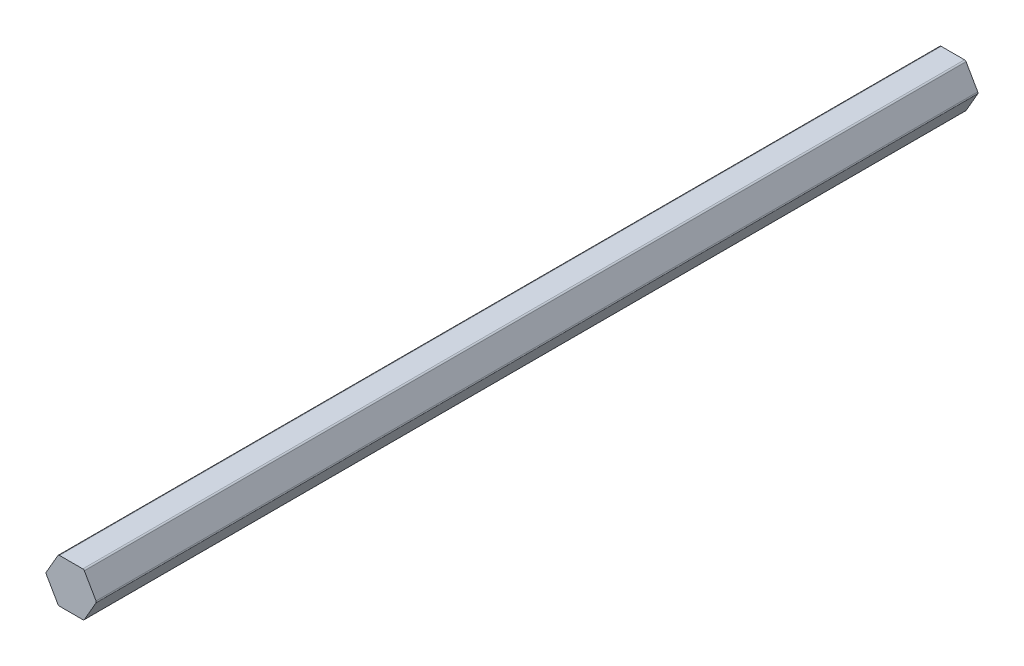
ISO-10303-21;
HEADER;
FILE_DESCRIPTION(('STEP AP214'),'2;1');
FILE_NAME('part.step','',(''),(''),'','','');
FILE_SCHEMA(('AUTOMOTIVE_DESIGN { 1 0 10303 214 1 1 1 1 }'));
ENDSEC;
DATA;
#1=APPLICATION_CONTEXT('core data for automotive mechanical design processes');
#2=APPLICATION_PROTOCOL_DEFINITION('international standard','automotive_design',2000,#1);
#3=PRODUCT_CONTEXT('',#1,'mechanical');
#4=PRODUCT('Part','Part','',(#3));
#5=PRODUCT_RELATED_PRODUCT_CATEGORY('part','',(#4));
#6=PRODUCT_DEFINITION_FORMATION('','',#4);
#7=PRODUCT_DEFINITION_CONTEXT('part definition',#1,'design');
#8=PRODUCT_DEFINITION('design','',#6,#7);
#9=PRODUCT_DEFINITION_SHAPE('','',#8);
#10=(LENGTH_UNIT() NAMED_UNIT(*) SI_UNIT(.MILLI.,.METRE.));
#11=(NAMED_UNIT(*) PLANE_ANGLE_UNIT() SI_UNIT($,.RADIAN.));
#12=(NAMED_UNIT(*) SI_UNIT($,.STERADIAN.) SOLID_ANGLE_UNIT());
#13=UNCERTAINTY_MEASURE_WITH_UNIT(LENGTH_MEASURE(1.E-05),#10,'distance_accuracy_value','');
#14=(GEOMETRIC_REPRESENTATION_CONTEXT(3) GLOBAL_UNCERTAINTY_ASSIGNED_CONTEXT((#13)) GLOBAL_UNIT_ASSIGNED_CONTEXT((#10,
#11,#12)) REPRESENTATION_CONTEXT('',''));
#15=CARTESIAN_POINT('',(0.,0.,0.));
#16=DIRECTION('',(0.,0.,1.));
#17=DIRECTION('',(1.,0.,0.));
#18=AXIS2_PLACEMENT_3D('',#15,#16,#17);
#19=CARTESIAN_POINT('',(-6.73109584837417,0.,457.2));
#20=DIRECTION('',(0.,0.,-1.));
#21=DIRECTION('',(-1.,0.,0.));
#22=AXIS2_PLACEMENT_3D('',#19,#20,#21);
#23=CYLINDRICAL_SURFACE('',#22,0.508);
#24=CARTESIAN_POINT('',(-6.73109584837417,0.,-203.2));
#25=DIRECTION('',(0.,0.,-1.));
#26=DIRECTION('',(-1.,0.,0.));
#27=AXIS2_PLACEMENT_3D('',#24,#25,#26);
#28=CIRCLE('',#27,0.508);
#29=CARTESIAN_POINT('',(-7.23909584837417,0.,-203.2));
#30=VERTEX_POINT('',#29);
#31=CARTESIAN_POINT('',(-7.17103675349666,-0.254000000000007,-203.2));
#32=VERTEX_POINT('',#31);
#33=EDGE_CURVE('E264',#30,#32,#28,.F.);
#34=ORIENTED_EDGE('',*,*,#33,.F.);
#35=DIRECTION('',(0.,0.,-1.));
#36=VECTOR('',#35,1.);
#37=CARTESIAN_POINT('',(-7.23909584837417,0.,457.2));
#38=LINE('',#37,#36);
#39=CARTESIAN_POINT('',(-7.23909584837417,0.,-457.2));
#40=VERTEX_POINT('',#39);
#41=EDGE_CURVE('E52',#30,#40,#38,.T.);
#42=ORIENTED_EDGE('',*,*,#41,.T.);
#43=CARTESIAN_POINT('',(-6.73109584837417,0.,-457.2));
#44=DIRECTION('',(0.,0.,-1.));
#45=DIRECTION('',(1.,0.,0.));
#46=AXIS2_PLACEMENT_3D('',#43,#44,#45);
#47=CIRCLE('',#46,0.508);
#48=CARTESIAN_POINT('',(-7.17103675349666,-0.254000000000004,-457.2));
#49=VERTEX_POINT('',#48);
#50=EDGE_CURVE('E192',#49,#40,#47,.T.);
#51=ORIENTED_EDGE('',*,*,#50,.F.);
#52=DIRECTION('',(0.,0.,-1.));
#53=VECTOR('',#52,1.);
#54=CARTESIAN_POINT('',(-7.17103675349666,-0.254000000000004,457.2));
#55=LINE('',#54,#53);
#56=EDGE_CURVE('E217',#32,#49,#55,.T.);
#57=ORIENTED_EDGE('',*,*,#56,.F.);
#58=EDGE_LOOP('',(#34,#42,#51,#57));
#59=FACE_BOUND('',#58,.T.);
#60=ADVANCED_FACE('F44',(#59),#23,.T.);
#61=CARTESIAN_POINT('',(3.65884186093541,-6.3373,457.2));
#62=DIRECTION('',(-0.866025403784439,0.5,0.));
#63=DIRECTION('',(0.,0.,1.));
#64=AXIS2_PLACEMENT_3D('',#61,#62,#63);
#65=PLANE('',#64);
#66=DIRECTION('',(0.,0.,1.));
#67=VECTOR('',#66,1.);
#68=CARTESIAN_POINT('',(7.17103675349667,-0.253999999999996,457.2));
#69=LINE('',#68,#67);
#70=CARTESIAN_POINT('',(7.17103675349666,-0.254,-457.2));
#71=VERTEX_POINT('',#70);
#72=CARTESIAN_POINT('',(7.17103675349666,-0.254000000000001,-203.2));
#73=VERTEX_POINT('',#72);
#74=EDGE_CURVE('E179',#71,#73,#69,.T.);
#75=ORIENTED_EDGE('',*,*,#74,.T.);
#76=DIRECTION('',(-0.5,-0.866025403784439,0.));
#77=VECTOR('',#76,1.);
#78=CARTESIAN_POINT('',(3.65884186093541,-6.3373,-203.2));
#79=LINE('',#78,#77);
#80=CARTESIAN_POINT('',(3.80548882930958,-6.0833,-203.2));
#81=VERTEX_POINT('',#80);
#82=EDGE_CURVE('E254',#73,#81,#79,.T.);
#83=ORIENTED_EDGE('',*,*,#82,.T.);
#84=DIRECTION('',(0.,0.,-1.));
#85=VECTOR('',#84,1.);
#86=CARTESIAN_POINT('',(3.80548882930958,-6.0833,457.2));
#87=LINE('',#86,#85);
#88=CARTESIAN_POINT('',(3.80548882930958,-6.0833,-457.2));
#89=VERTEX_POINT('',#88);
#90=EDGE_CURVE('E209',#81,#89,#87,.T.);
#91=ORIENTED_EDGE('',*,*,#90,.T.);
#92=DIRECTION('',(0.5,0.866025403784439,0.));
#93=VECTOR('',#92,1.);
#94=CARTESIAN_POINT('',(3.65884186093541,-6.3373,-457.2));
#95=LINE('',#94,#93);
#96=EDGE_CURVE('E205',#89,#71,#95,.T.);
#97=ORIENTED_EDGE('',*,*,#96,.T.);
#98=EDGE_LOOP('',(#75,#83,#91,#97));
#99=FACE_BOUND('',#98,.T.);
#100=ADVANCED_FACE('F293',(#99),#65,.F.);
#101=CARTESIAN_POINT('',(7.31768372187083,0.,457.2));
#102=DIRECTION('',(-0.866025403784439,-0.5,0.));
#103=DIRECTION('',(-0.5,0.866025403784439,0.));
#104=AXIS2_PLACEMENT_3D('',#101,#102,#103);
#105=PLANE('',#104);
#106=DIRECTION('',(0.,0.,1.));
#107=VECTOR('',#106,1.);
#108=CARTESIAN_POINT('',(3.80548882930958,6.0833,457.2));
#109=LINE('',#108,#107);
#110=CARTESIAN_POINT('',(3.80548882930957,6.0833,-457.2));
#111=VERTEX_POINT('',#110);
#112=CARTESIAN_POINT('',(3.80548882930958,6.0833,-203.2));
#113=VERTEX_POINT('',#112);
#114=EDGE_CURVE('E187',#111,#113,#109,.T.);
#115=ORIENTED_EDGE('',*,*,#114,.T.);
#116=DIRECTION('',(0.5,-0.866025403784439,0.));
#117=VECTOR('',#116,1.);
#118=CARTESIAN_POINT('',(7.31768372187083,0.,-203.2));
#119=LINE('',#118,#117);
#120=CARTESIAN_POINT('',(7.17103675349667,0.254000000000004,-203.2));
#121=VERTEX_POINT('',#120);
#122=EDGE_CURVE('E58',#113,#121,#119,.T.);
#123=ORIENTED_EDGE('',*,*,#122,.T.);
#124=DIRECTION('',(0.,0.,-1.));
#125=VECTOR('',#124,1.);
#126=CARTESIAN_POINT('',(7.17103675349666,0.254,457.2));
#127=LINE('',#126,#125);
#128=CARTESIAN_POINT('',(7.17103675349666,0.254000000000004,-457.2));
#129=VERTEX_POINT('',#128);
#130=EDGE_CURVE('E181',#121,#129,#127,.T.);
#131=ORIENTED_EDGE('',*,*,#130,.T.);
#132=DIRECTION('',(-0.5,0.866025403784439,0.));
#133=VECTOR('',#132,1.);
#134=CARTESIAN_POINT('',(7.31768372187083,0.,-457.2));
#135=LINE('',#134,#133);
#136=EDGE_CURVE('E183',#129,#111,#135,.T.);
#137=ORIENTED_EDGE('',*,*,#136,.T.);
#138=EDGE_LOOP('',(#115,#123,#131,#137));
#139=FACE_BOUND('',#138,.T.);
#140=ADVANCED_FACE('F298',(#139),#105,.F.);
#141=CARTESIAN_POINT('',(3.65884186093541,6.3373,457.2));
#142=DIRECTION('',(0.,-1.,0.));
#143=DIRECTION('',(0.,0.,-1.));
#144=AXIS2_PLACEMENT_3D('',#141,#142,#143);
#145=PLANE('',#144);
#146=DIRECTION('',(0.,0.,1.));
#147=VECTOR('',#146,1.);
#148=CARTESIAN_POINT('',(-3.36554792418709,6.3373,457.2));
#149=LINE('',#148,#147);
#150=CARTESIAN_POINT('',(-3.36554792418708,6.3373,-457.2));
#151=VERTEX_POINT('',#150);
#152=CARTESIAN_POINT('',(-3.36554792418708,6.3373,-203.2));
#153=VERTEX_POINT('',#152);
#154=EDGE_CURVE('E162',#151,#153,#149,.T.);
#155=ORIENTED_EDGE('',*,*,#154,.T.);
#156=DIRECTION('',(1.,0.,0.));
#157=VECTOR('',#156,1.);
#158=CARTESIAN_POINT('',(3.65884186093541,6.3373,-203.2));
#159=LINE('',#158,#157);
#160=CARTESIAN_POINT('',(3.36554792418709,6.3373,-203.2));
#161=VERTEX_POINT('',#160);
#162=EDGE_CURVE('E152',#153,#161,#159,.T.);
#163=ORIENTED_EDGE('',*,*,#162,.T.);
#164=DIRECTION('',(0.,0.,-1.));
#165=VECTOR('',#164,1.);
#166=CARTESIAN_POINT('',(3.36554792418709,6.3373,457.2));
#167=LINE('',#166,#165);
#168=CARTESIAN_POINT('',(3.36554792418709,6.3373,-457.2));
#169=VERTEX_POINT('',#168);
#170=EDGE_CURVE('E160',#161,#169,#167,.T.);
#171=ORIENTED_EDGE('',*,*,#170,.T.);
#172=DIRECTION('',(-1.,0.,0.));
#173=VECTOR('',#172,1.);
#174=CARTESIAN_POINT('',(3.65884186093541,6.3373,-457.2));
#175=LINE('',#174,#173);
#176=EDGE_CURVE('E171',#169,#151,#175,.T.);
#177=ORIENTED_EDGE('',*,*,#176,.T.);
#178=EDGE_LOOP('',(#155,#163,#171,#177));
#179=FACE_BOUND('',#178,.T.);
#180=ADVANCED_FACE('F46',(#179),#145,.F.);
#181=CARTESIAN_POINT('',(-3.65884186093541,6.3373,457.2));
#182=DIRECTION('',(0.866025403784439,-0.5,0.));
#183=DIRECTION('',(0.,0.,-1.));
#184=AXIS2_PLACEMENT_3D('',#181,#182,#183);
#185=PLANE('',#184);
#186=DIRECTION('',(0.,0.,1.));
#187=VECTOR('',#186,1.);
#188=CARTESIAN_POINT('',(-7.17103675349666,0.253999999999995,457.2));
#189=LINE('',#188,#187);
#190=CARTESIAN_POINT('',(-7.17103675349666,0.253999999999997,-457.2));
#191=VERTEX_POINT('',#190);
#192=CARTESIAN_POINT('',(-7.17103675349667,0.253999999999996,-203.2));
#193=VERTEX_POINT('',#192);
#194=EDGE_CURVE('E175',#191,#193,#189,.T.);
#195=ORIENTED_EDGE('',*,*,#194,.T.);
#196=DIRECTION('',(0.5,0.866025403784439,0.));
#197=VECTOR('',#196,1.);
#198=CARTESIAN_POINT('',(-3.65884186093541,6.3373,-203.2));
#199=LINE('',#198,#197);
#200=CARTESIAN_POINT('',(-3.80548882930958,6.0833,-203.2));
#201=VERTEX_POINT('',#200);
#202=EDGE_CURVE('E249',#193,#201,#199,.T.);
#203=ORIENTED_EDGE('',*,*,#202,.T.);
#204=DIRECTION('',(0.,0.,-1.));
#205=VECTOR('',#204,1.);
#206=CARTESIAN_POINT('',(-3.80548882930958,6.0833,457.2));
#207=LINE('',#206,#205);
#208=CARTESIAN_POINT('',(-3.80548882930958,6.0833,-457.2));
#209=VERTEX_POINT('',#208);
#210=EDGE_CURVE('E224',#201,#209,#207,.T.);
#211=ORIENTED_EDGE('',*,*,#210,.T.);
#212=DIRECTION('',(-0.5,-0.866025403784439,0.));
#213=VECTOR('',#212,1.);
#214=CARTESIAN_POINT('',(-3.65884186093541,6.3373,-457.2));
#215=LINE('',#214,#213);
#216=EDGE_CURVE('E168',#209,#191,#215,.T.);
#217=ORIENTED_EDGE('',*,*,#216,.T.);
#218=EDGE_LOOP('',(#195,#203,#211,#217));
#219=FACE_BOUND('',#218,.T.);
#220=ADVANCED_FACE('F291',(#219),#185,.F.);
#221=CARTESIAN_POINT('',(-7.31768372187083,0.,457.2));
#222=DIRECTION('',(0.866025403784438,0.5,0.));
#223=DIRECTION('',(0.,0.,-1.));
#224=AXIS2_PLACEMENT_3D('',#221,#222,#223);
#225=PLANE('',#224);
#226=DIRECTION('',(0.,0.,1.));
#227=VECTOR('',#226,1.);
#228=CARTESIAN_POINT('',(-3.80548882930957,-6.0833,457.2));
#229=LINE('',#228,#227);
#230=CARTESIAN_POINT('',(-3.80548882930957,-6.0833,-457.2));
#231=VERTEX_POINT('',#230);
#232=CARTESIAN_POINT('',(-3.80548882930958,-6.0833,-203.2));
#233=VERTEX_POINT('',#232);
#234=EDGE_CURVE('E213',#231,#233,#229,.T.);
#235=ORIENTED_EDGE('',*,*,#234,.T.);
#236=DIRECTION('',(-0.5,0.866025403784438,0.));
#237=VECTOR('',#236,1.);
#238=CARTESIAN_POINT('',(-7.31768372187083,0.,-203.2));
#239=LINE('',#238,#237);
#240=EDGE_CURVE('E268',#233,#32,#239,.T.);
#241=ORIENTED_EDGE('',*,*,#240,.T.);
#242=ORIENTED_EDGE('',*,*,#56,.T.);
#243=DIRECTION('',(0.5,-0.866025403784439,0.));
#244=VECTOR('',#243,1.);
#245=CARTESIAN_POINT('',(-7.31768372187083,0.,-457.2));
#246=LINE('',#245,#244);
#247=EDGE_CURVE('E216',#49,#231,#246,.T.);
#248=ORIENTED_EDGE('',*,*,#247,.T.);
#249=EDGE_LOOP('',(#235,#241,#242,#248));
#250=FACE_BOUND('',#249,.T.);
#251=ADVANCED_FACE('F307',(#250),#225,.F.);
#252=CARTESIAN_POINT('',(-3.6588418609354,-6.3373,457.2));
#253=DIRECTION('',(0.,1.,0.));
#254=DIRECTION('',(1.,0.,0.));
#255=AXIS2_PLACEMENT_3D('',#252,#253,#254);
#256=PLANE('',#255);
#257=DIRECTION('',(0.,0.,1.));
#258=VECTOR('',#257,1.);
#259=CARTESIAN_POINT('',(3.36554792418709,-6.3373,457.2));
#260=LINE('',#259,#258);
#261=CARTESIAN_POINT('',(3.36554792418709,-6.3373,-457.2));
#262=VERTEX_POINT('',#261);
#263=CARTESIAN_POINT('',(3.36554792418709,-6.3373,-203.2));
#264=VERTEX_POINT('',#263);
#265=EDGE_CURVE('E191',#262,#264,#260,.T.);
#266=ORIENTED_EDGE('',*,*,#265,.T.);
#267=DIRECTION('',(-1.,0.,0.));
#268=VECTOR('',#267,1.);
#269=CARTESIAN_POINT('',(-3.6588418609354,-6.3373,-203.2));
#270=LINE('',#269,#268);
#271=CARTESIAN_POINT('',(-3.36554792418708,-6.3373,-203.2));
#272=VERTEX_POINT('',#271);
#273=EDGE_CURVE('E261',#264,#272,#270,.T.);
#274=ORIENTED_EDGE('',*,*,#273,.T.);
#275=DIRECTION('',(0.,0.,-1.));
#276=VECTOR('',#275,1.);
#277=CARTESIAN_POINT('',(-3.36554792418708,-6.3373,457.2));
#278=LINE('',#277,#276);
#279=CARTESIAN_POINT('',(-3.36554792418708,-6.3373,-457.2));
#280=VERTEX_POINT('',#279);
#281=EDGE_CURVE('E226',#272,#280,#278,.T.);
#282=ORIENTED_EDGE('',*,*,#281,.T.);
#283=DIRECTION('',(1.,0.,0.));
#284=VECTOR('',#283,1.);
#285=CARTESIAN_POINT('',(-3.6588418609354,-6.3373,-457.2));
#286=LINE('',#285,#284);
#287=EDGE_CURVE('E197',#280,#262,#286,.T.);
#288=ORIENTED_EDGE('',*,*,#287,.T.);
#289=EDGE_LOOP('',(#266,#274,#282,#288));
#290=FACE_BOUND('',#289,.T.);
#291=ADVANCED_FACE('F310',(#290),#256,.F.);
#292=CARTESIAN_POINT('',(7.31768372187083,0.,-457.2));
#293=DIRECTION('',(0.,0.,1.));
#294=DIRECTION('',(1.,0.,0.));
#295=AXIS2_PLACEMENT_3D('',#292,#293,#294);
#296=PLANE('',#295);
#297=ORIENTED_EDGE('',*,*,#287,.F.);
#298=CARTESIAN_POINT('',(-3.36554792418708,-5.8293,-457.2));
#299=DIRECTION('',(0.,0.,-1.));
#300=DIRECTION('',(1.,0.,0.));
#301=AXIS2_PLACEMENT_3D('',#298,#299,#300);
#302=CIRCLE('',#301,0.508);
#303=EDGE_CURVE('E188',#280,#231,#302,.T.);
#304=ORIENTED_EDGE('',*,*,#303,.T.);
#305=ORIENTED_EDGE('',*,*,#247,.F.);
#306=ORIENTED_EDGE('',*,*,#50,.T.);
#307=CARTESIAN_POINT('',(-6.73109584837417,0.,-457.2));
#308=DIRECTION('',(0.,0.,-1.));
#309=DIRECTION('',(1.,0.,0.));
#310=AXIS2_PLACEMENT_3D('',#307,#308,#309);
#311=CIRCLE('',#310,0.508);
#312=EDGE_CURVE('E203',#40,#191,#311,.T.);
#313=ORIENTED_EDGE('',*,*,#312,.T.);
#314=ORIENTED_EDGE('',*,*,#216,.F.);
#315=CARTESIAN_POINT('',(-3.36554792418709,5.8293,-457.2));
#316=DIRECTION('',(0.,0.,-1.));
#317=DIRECTION('',(1.,0.,0.));
#318=AXIS2_PLACEMENT_3D('',#315,#316,#317);
#319=CIRCLE('',#318,0.508);
#320=EDGE_CURVE('E200',#209,#151,#319,.T.);
#321=ORIENTED_EDGE('',*,*,#320,.T.);
#322=ORIENTED_EDGE('',*,*,#176,.F.);
#323=CARTESIAN_POINT('',(3.36554792418709,5.8293,-457.2));
#324=DIRECTION('',(0.,0.,-1.));
#325=DIRECTION('',(1.,0.,0.));
#326=AXIS2_PLACEMENT_3D('',#323,#324,#325);
#327=CIRCLE('',#326,0.508);
#328=EDGE_CURVE('E167',#169,#111,#327,.T.);
#329=ORIENTED_EDGE('',*,*,#328,.T.);
#330=ORIENTED_EDGE('',*,*,#136,.F.);
#331=CARTESIAN_POINT('',(6.73109584837417,0.,-457.2));
#332=DIRECTION('',(0.,0.,-1.));
#333=DIRECTION('',(1.,0.,0.));
#334=AXIS2_PLACEMENT_3D('',#331,#332,#333);
#335=CIRCLE('',#334,0.508);
#336=EDGE_CURVE('E212',#129,#71,#335,.T.);
#337=ORIENTED_EDGE('',*,*,#336,.T.);
#338=ORIENTED_EDGE('',*,*,#96,.F.);
#339=CARTESIAN_POINT('',(3.36554792418709,-5.8293,-457.2));
#340=DIRECTION('',(0.,0.,-1.));
#341=DIRECTION('',(1.,0.,0.));
#342=AXIS2_PLACEMENT_3D('',#339,#340,#341);
#343=CIRCLE('',#342,0.508);
#344=EDGE_CURVE('E270',#89,#262,#343,.T.);
#345=ORIENTED_EDGE('',*,*,#344,.T.);
#346=EDGE_LOOP('',(#297,#304,#305,#306,#313,#314,#321,#322,#329,#330,#337,#338,#345));
#347=FACE_BOUND('',#346,.T.);
#348=ADVANCED_FACE('F240',(#347),#296,.F.);
#349=CARTESIAN_POINT('',(-3.36554792418708,-5.8293,457.2));
#350=DIRECTION('',(0.,0.,-1.));
#351=DIRECTION('',(-1.,0.,0.));
#352=AXIS2_PLACEMENT_3D('',#349,#350,#351);
#353=CYLINDRICAL_SURFACE('',#352,0.508);
#354=CARTESIAN_POINT('',(-3.36554792418708,-5.8293,-203.2));
#355=DIRECTION('',(0.,0.,-1.));
#356=DIRECTION('',(-1.,0.,0.));
#357=AXIS2_PLACEMENT_3D('',#354,#355,#356);
#358=CIRCLE('',#357,0.508);
#359=EDGE_CURVE('E266',#233,#272,#358,.F.);
#360=ORIENTED_EDGE('',*,*,#359,.F.);
#361=ORIENTED_EDGE('',*,*,#234,.F.);
#362=ORIENTED_EDGE('',*,*,#303,.F.);
#363=ORIENTED_EDGE('',*,*,#281,.F.);
#364=EDGE_LOOP('',(#360,#361,#362,#363));
#365=FACE_BOUND('',#364,.T.);
#366=ADVANCED_FACE('F303',(#365),#353,.T.);
#367=CARTESIAN_POINT('',(-6.73109584837417,0.,457.2));
#368=DIRECTION('',(0.,0.,-1.));
#369=DIRECTION('',(-1.,0.,0.));
#370=AXIS2_PLACEMENT_3D('',#367,#368,#369);
#371=CYLINDRICAL_SURFACE('',#370,0.508);
#372=CARTESIAN_POINT('',(-6.73109584837417,0.,-203.2));
#373=DIRECTION('',(0.,0.,-1.));
#374=DIRECTION('',(-1.,0.,0.));
#375=AXIS2_PLACEMENT_3D('',#372,#373,#374);
#376=CIRCLE('',#375,0.508);
#377=EDGE_CURVE('E259',#193,#30,#376,.F.);
#378=ORIENTED_EDGE('',*,*,#377,.F.);
#379=ORIENTED_EDGE('',*,*,#194,.F.);
#380=ORIENTED_EDGE('',*,*,#312,.F.);
#381=ORIENTED_EDGE('',*,*,#41,.F.);
#382=EDGE_LOOP('',(#378,#379,#380,#381));
#383=FACE_BOUND('',#382,.T.);
#384=ADVANCED_FACE('F289',(#383),#371,.T.);
#385=CARTESIAN_POINT('',(3.36554792418709,-5.8293,457.2));
#386=DIRECTION('',(0.,0.,-1.));
#387=DIRECTION('',(-1.,0.,0.));
#388=AXIS2_PLACEMENT_3D('',#385,#386,#387);
#389=CYLINDRICAL_SURFACE('',#388,0.508);
#390=CARTESIAN_POINT('',(3.36554792418709,-5.8293,-203.2));
#391=DIRECTION('',(0.,0.,-1.));
#392=DIRECTION('',(-1.,0.,0.));
#393=AXIS2_PLACEMENT_3D('',#390,#391,#392);
#394=CIRCLE('',#393,0.508);
#395=EDGE_CURVE('E257',#264,#81,#394,.F.);
#396=ORIENTED_EDGE('',*,*,#395,.F.);
#397=ORIENTED_EDGE('',*,*,#265,.F.);
#398=ORIENTED_EDGE('',*,*,#344,.F.);
#399=ORIENTED_EDGE('',*,*,#90,.F.);
#400=EDGE_LOOP('',(#396,#397,#398,#399));
#401=FACE_BOUND('',#400,.T.);
#402=ADVANCED_FACE('F311',(#401),#389,.T.);
#403=CARTESIAN_POINT('',(6.73109584837417,0.,457.2));
#404=DIRECTION('',(0.,0.,-1.));
#405=DIRECTION('',(-1.,0.,0.));
#406=AXIS2_PLACEMENT_3D('',#403,#404,#405);
#407=CYLINDRICAL_SURFACE('',#406,0.508);
#408=CARTESIAN_POINT('',(6.73109584837417,0.,-203.2));
#409=DIRECTION('',(0.,0.,-1.));
#410=DIRECTION('',(-1.,0.,0.));
#411=AXIS2_PLACEMENT_3D('',#408,#409,#410);
#412=CIRCLE('',#411,0.508);
#413=EDGE_CURVE('E247',#73,#121,#412,.F.);
#414=ORIENTED_EDGE('',*,*,#413,.F.);
#415=ORIENTED_EDGE('',*,*,#74,.F.);
#416=ORIENTED_EDGE('',*,*,#336,.F.);
#417=ORIENTED_EDGE('',*,*,#130,.F.);
#418=EDGE_LOOP('',(#414,#415,#416,#417));
#419=FACE_BOUND('',#418,.T.);
#420=ADVANCED_FACE('F313',(#419),#407,.T.);
#421=CARTESIAN_POINT('',(-3.36554792418709,5.8293,457.2));
#422=DIRECTION('',(0.,0.,-1.));
#423=DIRECTION('',(-1.,0.,0.));
#424=AXIS2_PLACEMENT_3D('',#421,#422,#423);
#425=CYLINDRICAL_SURFACE('',#424,0.508);
#426=CARTESIAN_POINT('',(-3.36554792418709,5.8293,-203.2));
#427=DIRECTION('',(0.,0.,-1.));
#428=DIRECTION('',(-1.,0.,0.));
#429=AXIS2_PLACEMENT_3D('',#426,#427,#428);
#430=CIRCLE('',#429,0.508);
#431=EDGE_CURVE('E245',#153,#201,#430,.F.);
#432=ORIENTED_EDGE('',*,*,#431,.F.);
#433=ORIENTED_EDGE('',*,*,#154,.F.);
#434=ORIENTED_EDGE('',*,*,#320,.F.);
#435=ORIENTED_EDGE('',*,*,#210,.F.);
#436=EDGE_LOOP('',(#432,#433,#434,#435));
#437=FACE_BOUND('',#436,.T.);
#438=ADVANCED_FACE('F244',(#437),#425,.T.);
#439=CARTESIAN_POINT('',(3.36554792418709,5.8293,457.2));
#440=DIRECTION('',(0.,0.,-1.));
#441=DIRECTION('',(-1.,0.,0.));
#442=AXIS2_PLACEMENT_3D('',#439,#440,#441);
#443=CYLINDRICAL_SURFACE('',#442,0.508);
#444=CARTESIAN_POINT('',(3.36554792418709,5.8293,-203.2));
#445=DIRECTION('',(0.,0.,-1.));
#446=DIRECTION('',(-1.,0.,0.));
#447=AXIS2_PLACEMENT_3D('',#444,#445,#446);
#448=CIRCLE('',#447,0.508);
#449=EDGE_CURVE('E11',#113,#161,#448,.F.);
#450=ORIENTED_EDGE('',*,*,#449,.F.);
#451=ORIENTED_EDGE('',*,*,#114,.F.);
#452=ORIENTED_EDGE('',*,*,#328,.F.);
#453=ORIENTED_EDGE('',*,*,#170,.F.);
#454=EDGE_LOOP('',(#450,#451,#452,#453));
#455=FACE_BOUND('',#454,.T.);
#456=ADVANCED_FACE('F165',(#455),#443,.T.);
#457=CARTESIAN_POINT('',(0.,0.,-203.2));
#458=DIRECTION('',(0.,0.,-1.));
#459=DIRECTION('',(-1.,0.,0.));
#460=AXIS2_PLACEMENT_3D('',#457,#458,#459);
#461=PLANE('',#460);
#462=ORIENTED_EDGE('',*,*,#359,.T.);
#463=ORIENTED_EDGE('',*,*,#273,.F.);
#464=ORIENTED_EDGE('',*,*,#395,.T.);
#465=ORIENTED_EDGE('',*,*,#82,.F.);
#466=ORIENTED_EDGE('',*,*,#413,.T.);
#467=ORIENTED_EDGE('',*,*,#122,.F.);
#468=ORIENTED_EDGE('',*,*,#449,.T.);
#469=ORIENTED_EDGE('',*,*,#162,.F.);
#470=ORIENTED_EDGE('',*,*,#431,.T.);
#471=ORIENTED_EDGE('',*,*,#202,.F.);
#472=ORIENTED_EDGE('',*,*,#377,.T.);
#473=ORIENTED_EDGE('',*,*,#33,.T.);
#474=ORIENTED_EDGE('',*,*,#240,.F.);
#475=EDGE_LOOP('',(#462,#463,#464,#465,#466,#467,#468,#469,#470,#471,#472,#473,#474));
#476=FACE_BOUND('',#475,.T.);
#477=ADVANCED_FACE('F151',(#476),#461,.F.);
#478=CLOSED_SHELL('',(#60,#100,#140,#180,#220,#251,#291,#348,#366,#384,#402,#420,#438,#456,#477));
#479=MANIFOLD_SOLID_BREP('B2',#478);
#480=ADVANCED_BREP_SHAPE_REPRESENTATION('',(#18,#479),#14);
#481=SHAPE_DEFINITION_REPRESENTATION(#9,#480);
ENDSEC;
END-ISO-10303-21;
